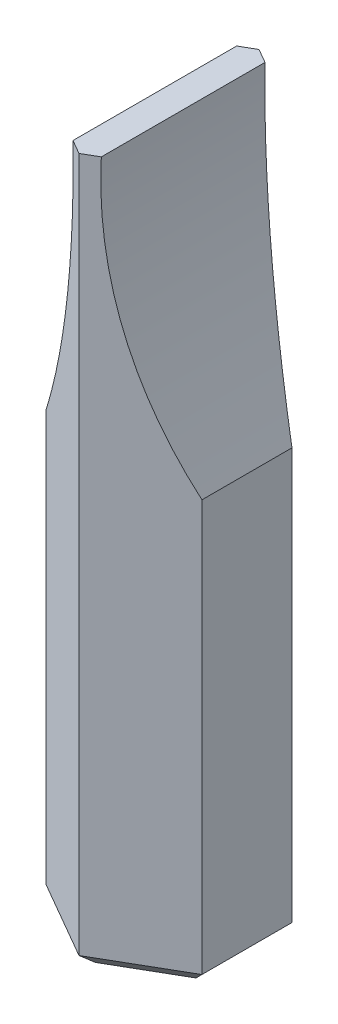
ISO-10303-21;
HEADER;
FILE_DESCRIPTION(('STEP AP214'),'2;1');
FILE_NAME('part.step','',(''),(''),'','','');
FILE_SCHEMA(('AUTOMOTIVE_DESIGN { 1 0 10303 214 1 1 1 1 }'));
ENDSEC;
DATA;
#1=APPLICATION_CONTEXT('core data for automotive mechanical design processes');
#2=APPLICATION_PROTOCOL_DEFINITION('international standard','automotive_design',2000,#1);
#3=PRODUCT_CONTEXT('',#1,'mechanical');
#4=PRODUCT('Part','Part','',(#3));
#5=PRODUCT_RELATED_PRODUCT_CATEGORY('part','',(#4));
#6=PRODUCT_DEFINITION_FORMATION('','',#4);
#7=PRODUCT_DEFINITION_CONTEXT('part definition',#1,'design');
#8=PRODUCT_DEFINITION('design','',#6,#7);
#9=PRODUCT_DEFINITION_SHAPE('','',#8);
#10=(LENGTH_UNIT() NAMED_UNIT(*) SI_UNIT(.MILLI.,.METRE.));
#11=(NAMED_UNIT(*) PLANE_ANGLE_UNIT() SI_UNIT($,.RADIAN.));
#12=(NAMED_UNIT(*) SI_UNIT($,.STERADIAN.) SOLID_ANGLE_UNIT());
#13=UNCERTAINTY_MEASURE_WITH_UNIT(LENGTH_MEASURE(1.E-05),#10,'distance_accuracy_value','');
#14=(GEOMETRIC_REPRESENTATION_CONTEXT(3) GLOBAL_UNCERTAINTY_ASSIGNED_CONTEXT((#13)) GLOBAL_UNIT_ASSIGNED_CONTEXT((#10,
#11,#12)) REPRESENTATION_CONTEXT('',''));
#15=CARTESIAN_POINT('',(0.,0.,0.));
#16=DIRECTION('',(0.,0.,1.));
#17=DIRECTION('',(1.,0.,0.));
#18=AXIS2_PLACEMENT_3D('',#15,#16,#17);
#19=CARTESIAN_POINT('',(2.74963065701557,25.,-1.58750000000003));
#20=DIRECTION('',(-0.499999999999995,0.,0.866025403784442));
#21=DIRECTION('',(0.866025403784442,0.,0.499999999999995));
#22=AXIS2_PLACEMENT_3D('',#19,#20,#21);
#23=PLANE('',#22);
#24=DIRECTION('',(0.,-1.,0.));
#25=VECTOR('',#24,1.);
#26=CARTESIAN_POINT('',(2.74963065701557,25.,-1.58750000000003));
#27=LINE('',#26,#25);
#28=CARTESIAN_POINT('',(2.74963065701561,15.,-1.58750000000003));
#29=VERTEX_POINT('',#28);
#30=CARTESIAN_POINT('',(2.74963065701557,0.5,-1.58750000000003));
#31=VERTEX_POINT('',#30);
#32=EDGE_CURVE('E128',#29,#31,#27,.T.);
#33=ORIENTED_EDGE('',*,*,#32,.T.);
#34=DIRECTION('',(-0.866025403784442,0.,-0.499999999999995));
#35=VECTOR('',#34,1.);
#36=CARTESIAN_POINT('',(2.74963065701557,0.5,-1.58750000000003));
#37=LINE('',#36,#35);
#38=CARTESIAN_POINT('',(0.,0.5,-3.175));
#39=VERTEX_POINT('',#38);
#40=EDGE_CURVE('E11',#31,#39,#37,.T.);
#41=ORIENTED_EDGE('',*,*,#40,.T.);
#42=DIRECTION('',(0.,-1.,0.));
#43=VECTOR('',#42,1.);
#44=CARTESIAN_POINT('',(0.,25.,-3.175));
#45=LINE('',#44,#43);
#46=CARTESIAN_POINT('',(0.,25.,-3.175));
#47=VERTEX_POINT('',#46);
#48=EDGE_CURVE('E152',#47,#39,#45,.T.);
#49=ORIENTED_EDGE('',*,*,#48,.F.);
#50=DIRECTION('',(-0.866025403784442,0.,-0.499999999999995));
#51=VECTOR('',#50,1.);
#52=CARTESIAN_POINT('',(2.74963065701557,25.,-1.58750000000003));
#53=LINE('',#52,#51);
#54=CARTESIAN_POINT('',(0.500000000000011,25.,-2.88632486540518));
#55=VERTEX_POINT('',#54);
#56=EDGE_CURVE('E131',#55,#47,#53,.T.);
#57=ORIENTED_EDGE('',*,*,#56,.F.);
#58=CARTESIAN_POINT('',(20.6488077793924,24.2796956636343,8.74659472987688));
#59=DIRECTION('',(-0.499999999999995,0.,0.866025403784442));
#60=DIRECTION('',(0.866025403784442,0.,0.499999999999995));
#61=AXIS2_PLACEMENT_3D('',#58,#59,#60);
#62=ELLIPSE('',#61,23.2807014003126,20.1616788305907);
#63=EDGE_CURVE('E121',#55,#29,#62,.T.);
#64=ORIENTED_EDGE('',*,*,#63,.T.);
#65=EDGE_LOOP('',(#33,#41,#49,#57,#64));
#66=FACE_BOUND('',#65,.T.);
#67=ADVANCED_FACE('F33',(#66),#23,.F.);
#68=CARTESIAN_POINT('',(0.,25.,-3.175));
#69=DIRECTION('',(0.500000000000001,0.,0.866025403784438));
#70=DIRECTION('',(0.866025403784438,0.,-0.500000000000001));
#71=AXIS2_PLACEMENT_3D('',#68,#69,#70);
#72=PLANE('',#71);
#73=ORIENTED_EDGE('',*,*,#48,.T.);
#74=DIRECTION('',(-0.866025403784438,0.,0.500000000000001));
#75=VECTOR('',#74,1.);
#76=CARTESIAN_POINT('',(0.,0.5,-3.175));
#77=LINE('',#76,#75);
#78=CARTESIAN_POINT('',(-2.7496306570156,0.5,-1.58749999999999));
#79=VERTEX_POINT('',#78);
#80=EDGE_CURVE('E159',#39,#79,#77,.T.);
#81=ORIENTED_EDGE('',*,*,#80,.T.);
#82=DIRECTION('',(0.,-1.,0.));
#83=VECTOR('',#82,1.);
#84=CARTESIAN_POINT('',(-2.7496306570156,25.,-1.58749999999999));
#85=LINE('',#84,#83);
#86=CARTESIAN_POINT('',(-2.74963065701558,15.,-1.58749999999999));
#87=VERTEX_POINT('',#86);
#88=EDGE_CURVE('E149',#87,#79,#85,.T.);
#89=ORIENTED_EDGE('',*,*,#88,.F.);
#90=CARTESIAN_POINT('',(-20.6488077793924,24.2796956636343,8.74659472987705));
#91=DIRECTION('',(0.500000000000001,0.,0.866025403784438));
#92=DIRECTION('',(-0.866025403784438,0.,0.500000000000001));
#93=AXIS2_PLACEMENT_3D('',#90,#91,#92);
#94=ELLIPSE('',#93,23.2807014003127,20.1616788305907);
#95=CARTESIAN_POINT('',(-0.499999999999978,25.,-2.8863248654052));
#96=VERTEX_POINT('',#95);
#97=EDGE_CURVE('E220',#87,#96,#94,.T.);
#98=ORIENTED_EDGE('',*,*,#97,.T.);
#99=DIRECTION('',(-0.866025403784438,0.,0.500000000000001));
#100=VECTOR('',#99,1.);
#101=CARTESIAN_POINT('',(0.,25.,-3.175));
#102=LINE('',#101,#100);
#103=EDGE_CURVE('E219',#47,#96,#102,.T.);
#104=ORIENTED_EDGE('',*,*,#103,.F.);
#105=EDGE_LOOP('',(#73,#81,#89,#98,#104));
#106=FACE_BOUND('',#105,.T.);
#107=ADVANCED_FACE('F215',(#106),#72,.F.);
#108=CARTESIAN_POINT('',(-2.7496306570156,25.,-1.58749999999999));
#109=DIRECTION('',(1.,0.,0.));
#110=DIRECTION('',(0.,0.,-1.));
#111=AXIS2_PLACEMENT_3D('',#108,#109,#110);
#112=PLANE('',#111);
#113=ORIENTED_EDGE('',*,*,#88,.T.);
#114=DIRECTION('',(0.,0.,1.));
#115=VECTOR('',#114,1.);
#116=CARTESIAN_POINT('',(-2.7496306570156,0.5,-1.58749999999999));
#117=LINE('',#116,#115);
#118=CARTESIAN_POINT('',(-2.74963065701558,0.5,1.58750000000001));
#119=VERTEX_POINT('',#118);
#120=EDGE_CURVE('E175',#79,#119,#117,.T.);
#121=ORIENTED_EDGE('',*,*,#120,.T.);
#122=DIRECTION('',(0.,-1.,0.));
#123=VECTOR('',#122,1.);
#124=CARTESIAN_POINT('',(-2.74963065701558,25.,1.58750000000001));
#125=LINE('',#124,#123);
#126=CARTESIAN_POINT('',(-2.74963065701558,15.,1.58750000000001));
#127=VERTEX_POINT('',#126);
#128=EDGE_CURVE('E146',#127,#119,#125,.T.);
#129=ORIENTED_EDGE('',*,*,#128,.F.);
#130=DIRECTION('',(0.,0.,1.));
#131=VECTOR('',#130,1.);
#132=CARTESIAN_POINT('',(-2.74963065701558,15.,-3.175));
#133=LINE('',#132,#131);
#134=EDGE_CURVE('E132',#87,#127,#133,.T.);
#135=ORIENTED_EDGE('',*,*,#134,.F.);
#136=EDGE_LOOP('',(#113,#121,#129,#135));
#137=FACE_BOUND('',#136,.T.);
#138=ADVANCED_FACE('F258',(#137),#112,.F.);
#139=CARTESIAN_POINT('',(-2.74963065701558,25.,1.58750000000001));
#140=DIRECTION('',(0.499999999999995,0.,-0.866025403784442));
#141=DIRECTION('',(-0.866025403784442,0.,-0.499999999999995));
#142=AXIS2_PLACEMENT_3D('',#139,#140,#141);
#143=PLANE('',#142);
#144=ORIENTED_EDGE('',*,*,#128,.T.);
#145=DIRECTION('',(0.866025403784442,0.,0.499999999999995));
#146=VECTOR('',#145,1.);
#147=CARTESIAN_POINT('',(-2.74963065701558,0.5,1.58750000000001));
#148=LINE('',#147,#146);
#149=CARTESIAN_POINT('',(0.,0.5,3.175));
#150=VERTEX_POINT('',#149);
#151=EDGE_CURVE('E177',#119,#150,#148,.T.);
#152=ORIENTED_EDGE('',*,*,#151,.T.);
#153=DIRECTION('',(0.,-1.,0.));
#154=VECTOR('',#153,1.);
#155=CARTESIAN_POINT('',(0.,25.,3.175));
#156=LINE('',#155,#154);
#157=CARTESIAN_POINT('',(0.,25.,3.175));
#158=VERTEX_POINT('',#157);
#159=EDGE_CURVE('E138',#158,#150,#156,.T.);
#160=ORIENTED_EDGE('',*,*,#159,.F.);
#161=DIRECTION('',(0.866025403784441,0.,0.499999999999995));
#162=VECTOR('',#161,1.);
#163=CARTESIAN_POINT('',(-2.74963065701558,25.,1.58750000000001));
#164=LINE('',#163,#162);
#165=CARTESIAN_POINT('',(-0.499999999999976,25.,2.88632486540519));
#166=VERTEX_POINT('',#165);
#167=EDGE_CURVE('E141',#166,#158,#164,.T.);
#168=ORIENTED_EDGE('',*,*,#167,.F.);
#169=CARTESIAN_POINT('',(-20.6488077793924,24.2796956636343,-8.74659472987687));
#170=DIRECTION('',(0.499999999999995,0.,-0.866025403784442));
#171=DIRECTION('',(0.866025403784442,0.,0.499999999999995));
#172=AXIS2_PLACEMENT_3D('',#169,#170,#171);
#173=ELLIPSE('',#172,23.2807014003126,20.1616788305907);
#174=EDGE_CURVE('E227',#166,#127,#173,.T.);
#175=ORIENTED_EDGE('',*,*,#174,.T.);
#176=EDGE_LOOP('',(#144,#152,#160,#168,#175));
#177=FACE_BOUND('',#176,.T.);
#178=ADVANCED_FACE('F237',(#177),#143,.F.);
#179=CARTESIAN_POINT('',(0.,25.,3.175));
#180=DIRECTION('',(-0.500000000000007,0.,-0.866025403784434));
#181=DIRECTION('',(-0.866025403784435,0.,0.500000000000007));
#182=AXIS2_PLACEMENT_3D('',#179,#180,#181);
#183=PLANE('',#182);
#184=ORIENTED_EDGE('',*,*,#159,.T.);
#185=DIRECTION('',(0.866025403784435,0.,-0.500000000000007));
#186=VECTOR('',#185,1.);
#187=CARTESIAN_POINT('',(0.,0.5,3.175));
#188=LINE('',#187,#186);
#189=CARTESIAN_POINT('',(2.74963065701561,0.5,1.58749999999997));
#190=VERTEX_POINT('',#189);
#191=EDGE_CURVE('E57',#150,#190,#188,.T.);
#192=ORIENTED_EDGE('',*,*,#191,.T.);
#193=DIRECTION('',(0.,-1.,0.));
#194=VECTOR('',#193,1.);
#195=CARTESIAN_POINT('',(2.74963065701561,25.,1.58749999999997));
#196=LINE('',#195,#194);
#197=CARTESIAN_POINT('',(2.74963065701561,15.,1.58749999999998));
#198=VERTEX_POINT('',#197);
#199=EDGE_CURVE('E135',#198,#190,#196,.T.);
#200=ORIENTED_EDGE('',*,*,#199,.F.);
#201=CARTESIAN_POINT('',(20.6488077793924,24.2796956636343,-8.74659472987725));
#202=DIRECTION('',(-0.500000000000007,0.,-0.866025403784434));
#203=DIRECTION('',(-0.866025403784435,0.,0.500000000000007));
#204=AXIS2_PLACEMENT_3D('',#201,#202,#203);
#205=ELLIPSE('',#204,23.2807014003128,20.1616788305907);
#206=CARTESIAN_POINT('',(0.500000000000022,25.,2.88632486540519));
#207=VERTEX_POINT('',#206);
#208=EDGE_CURVE('E124',#198,#207,#205,.T.);
#209=ORIENTED_EDGE('',*,*,#208,.T.);
#210=DIRECTION('',(0.866025403784434,0.,-0.500000000000007));
#211=VECTOR('',#210,1.);
#212=CARTESIAN_POINT('',(0.,25.,3.175));
#213=LINE('',#212,#211);
#214=EDGE_CURVE('E136',#158,#207,#213,.T.);
#215=ORIENTED_EDGE('',*,*,#214,.F.);
#216=EDGE_LOOP('',(#184,#192,#200,#209,#215));
#217=FACE_BOUND('',#216,.T.);
#218=ADVANCED_FACE('F232',(#217),#183,.F.);
#219=CARTESIAN_POINT('',(2.74963065701561,25.,1.58749999999997));
#220=DIRECTION('',(-1.,0.,0.));
#221=DIRECTION('',(0.,0.,1.));
#222=AXIS2_PLACEMENT_3D('',#219,#220,#221);
#223=PLANE('',#222);
#224=ORIENTED_EDGE('',*,*,#199,.T.);
#225=DIRECTION('',(0.,0.,-1.));
#226=VECTOR('',#225,1.);
#227=CARTESIAN_POINT('',(2.74963065701561,0.5,1.58749999999997));
#228=LINE('',#227,#226);
#229=EDGE_CURVE('E42',#190,#31,#228,.T.);
#230=ORIENTED_EDGE('',*,*,#229,.T.);
#231=ORIENTED_EDGE('',*,*,#32,.F.);
#232=DIRECTION('',(0.,0.,1.));
#233=VECTOR('',#232,1.);
#234=CARTESIAN_POINT('',(2.74963065701561,15.,-3.175));
#235=LINE('',#234,#233);
#236=EDGE_CURVE('E118',#29,#198,#235,.T.);
#237=ORIENTED_EDGE('',*,*,#236,.T.);
#238=EDGE_LOOP('',(#224,#230,#231,#237));
#239=FACE_BOUND('',#238,.T.);
#240=ADVANCED_FACE('F134',(#239),#223,.F.);
#241=CARTESIAN_POINT('',(0.,25.,0.));
#242=DIRECTION('',(0.,1.,0.));
#243=DIRECTION('',(0.,0.,1.));
#244=AXIS2_PLACEMENT_3D('',#241,#242,#243);
#245=PLANE('',#244);
#246=DIRECTION('',(0.,0.,1.));
#247=VECTOR('',#246,1.);
#248=CARTESIAN_POINT('',(0.500000000000011,25.,-3.175));
#249=LINE('',#248,#247);
#250=EDGE_CURVE('E157',#55,#207,#249,.T.);
#251=ORIENTED_EDGE('',*,*,#250,.F.);
#252=ORIENTED_EDGE('',*,*,#56,.T.);
#253=ORIENTED_EDGE('',*,*,#103,.T.);
#254=DIRECTION('',(0.,0.,1.));
#255=VECTOR('',#254,1.);
#256=CARTESIAN_POINT('',(-0.499999999999976,25.,-3.175));
#257=LINE('',#256,#255);
#258=EDGE_CURVE('E155',#166,#96,#257,.F.);
#259=ORIENTED_EDGE('',*,*,#258,.F.);
#260=ORIENTED_EDGE('',*,*,#167,.T.);
#261=ORIENTED_EDGE('',*,*,#214,.T.);
#262=EDGE_LOOP('',(#251,#252,#253,#259,#260,#261));
#263=FACE_BOUND('',#262,.T.);
#264=ADVANCED_FACE('F233',(#263),#245,.T.);
#265=CARTESIAN_POINT('',(0.,0.,0.));
#266=DIRECTION('',(0.,1.,0.));
#267=DIRECTION('',(0.,0.,1.));
#268=AXIS2_PLACEMENT_3D('',#265,#266,#267);
#269=PLANE('',#268);
#270=DIRECTION('',(0.,0.,-1.));
#271=VECTOR('',#270,1.);
#272=CARTESIAN_POINT('',(-2.24963065701559,0.,0.));
#273=LINE('',#272,#271);
#274=CARTESIAN_POINT('',(-2.24963065701558,0.,1.2988248654052));
#275=VERTEX_POINT('',#274);
#276=CARTESIAN_POINT('',(-2.24963065701559,0.,-1.29882486540518));
#277=VERTEX_POINT('',#276);
#278=EDGE_CURVE('E170',#275,#277,#273,.T.);
#279=ORIENTED_EDGE('',*,*,#278,.T.);
#280=DIRECTION('',(0.866025403784438,0.,-0.500000000000001));
#281=VECTOR('',#280,1.);
#282=CARTESIAN_POINT('',(-1.1248153285078,0.,-1.94823729810778));
#283=LINE('',#282,#281);
#284=CARTESIAN_POINT('',(0.,0.,-2.59764973081037));
#285=VERTEX_POINT('',#284);
#286=EDGE_CURVE('E172',#277,#285,#283,.T.);
#287=ORIENTED_EDGE('',*,*,#286,.T.);
#288=DIRECTION('',(0.866025403784442,0.,0.499999999999995));
#289=VECTOR('',#288,1.);
#290=CARTESIAN_POINT('',(1.12481532850779,0.,-1.94823729810779));
#291=LINE('',#290,#289);
#292=CARTESIAN_POINT('',(2.24963065701558,0.,-1.29882486540521));
#293=VERTEX_POINT('',#292);
#294=EDGE_CURVE('E162',#285,#293,#291,.T.);
#295=ORIENTED_EDGE('',*,*,#294,.T.);
#296=DIRECTION('',(0.,0.,1.));
#297=VECTOR('',#296,1.);
#298=CARTESIAN_POINT('',(2.24963065701559,0.,0.));
#299=LINE('',#298,#297);
#300=CARTESIAN_POINT('',(2.2496306570156,0.,1.29882486540517));
#301=VERTEX_POINT('',#300);
#302=EDGE_CURVE('E164',#293,#301,#299,.T.);
#303=ORIENTED_EDGE('',*,*,#302,.T.);
#304=DIRECTION('',(-0.866025403784435,0.,0.500000000000007));
#305=VECTOR('',#304,1.);
#306=CARTESIAN_POINT('',(1.12481532850781,0.,1.94823729810777));
#307=LINE('',#306,#305);
#308=CARTESIAN_POINT('',(0.,0.,2.59764973081037));
#309=VERTEX_POINT('',#308);
#310=EDGE_CURVE('E166',#301,#309,#307,.T.);
#311=ORIENTED_EDGE('',*,*,#310,.T.);
#312=DIRECTION('',(-0.866025403784442,0.,-0.499999999999995));
#313=VECTOR('',#312,1.);
#314=CARTESIAN_POINT('',(-1.12481532850778,0.,1.94823729810778));
#315=LINE('',#314,#313);
#316=EDGE_CURVE('E168',#309,#275,#315,.T.);
#317=ORIENTED_EDGE('',*,*,#316,.T.);
#318=EDGE_LOOP('',(#279,#287,#295,#303,#311,#317));
#319=FACE_BOUND('',#318,.T.);
#320=ADVANCED_FACE('F204',(#319),#269,.F.);
#321=CARTESIAN_POINT('',(-20.6488077793924,24.2796956636343,-3.175));
#322=DIRECTION('',(0.,0.,1.));
#323=DIRECTION('',(1.,0.,0.));
#324=AXIS2_PLACEMENT_3D('',#321,#322,#323);
#325=CYLINDRICAL_SURFACE('',#324,20.1616788305907);
#326=ORIENTED_EDGE('',*,*,#134,.T.);
#327=ORIENTED_EDGE('',*,*,#174,.F.);
#328=ORIENTED_EDGE('',*,*,#258,.T.);
#329=ORIENTED_EDGE('',*,*,#97,.F.);
#330=EDGE_LOOP('',(#326,#327,#328,#329));
#331=FACE_BOUND('',#330,.T.);
#332=ADVANCED_FACE('F272',(#331),#325,.F.);
#333=CARTESIAN_POINT('',(20.6488077793924,24.2796956636343,-3.175));
#334=DIRECTION('',(0.,0.,1.));
#335=DIRECTION('',(1.,0.,0.));
#336=AXIS2_PLACEMENT_3D('',#333,#334,#335);
#337=CYLINDRICAL_SURFACE('',#336,20.1616788305907);
#338=ORIENTED_EDGE('',*,*,#250,.T.);
#339=ORIENTED_EDGE('',*,*,#208,.F.);
#340=ORIENTED_EDGE('',*,*,#236,.F.);
#341=ORIENTED_EDGE('',*,*,#63,.F.);
#342=EDGE_LOOP('',(#338,#339,#340,#341));
#343=FACE_BOUND('',#342,.T.);
#344=ADVANCED_FACE('F120',(#343),#337,.F.);
#345=CARTESIAN_POINT('',(0.,0.5,3.175));
#346=DIRECTION('',(-0.353553390593279,0.707106781186548,-0.612372435695791));
#347=DIRECTION('',(0.866025403784435,0.,-0.500000000000007));
#348=AXIS2_PLACEMENT_3D('',#345,#346,#347);
#349=PLANE('',#348);
#350=DIRECTION('',(0.,-0.654653670707976,-0.755928946018455));
#351=VECTOR('',#350,1.);
#352=CARTESIAN_POINT('',(0.,0.500000000000001,3.175));
#353=LINE('',#352,#351);
#354=EDGE_CURVE('E190',#309,#150,#353,.F.);
#355=ORIENTED_EDGE('',*,*,#354,.F.);
#356=ORIENTED_EDGE('',*,*,#310,.F.);
#357=DIRECTION('',(-0.654653670707981,-0.654653670707976,-0.377964473009221));
#358=VECTOR('',#357,1.);
#359=CARTESIAN_POINT('',(2.74963065701561,0.500000000000001,1.58749999999997));
#360=LINE('',#359,#358);
#361=EDGE_CURVE('E37',#190,#301,#360,.T.);
#362=ORIENTED_EDGE('',*,*,#361,.F.);
#363=ORIENTED_EDGE('',*,*,#191,.F.);
#364=EDGE_LOOP('',(#355,#356,#362,#363));
#365=FACE_BOUND('',#364,.T.);
#366=ADVANCED_FACE('F35',(#365),#349,.F.);
#367=CARTESIAN_POINT('',(2.74963065701561,0.5,1.58749999999997));
#368=DIRECTION('',(-0.707106781186547,0.707106781186548,0.));
#369=DIRECTION('',(0.,0.,-1.));
#370=AXIS2_PLACEMENT_3D('',#367,#368,#369);
#371=PLANE('',#370);
#372=ORIENTED_EDGE('',*,*,#361,.T.);
#373=ORIENTED_EDGE('',*,*,#302,.F.);
#374=DIRECTION('',(-0.654653670707974,-0.654653670707977,0.377964473009233));
#375=VECTOR('',#374,1.);
#376=CARTESIAN_POINT('',(2.74963065701557,0.5,-1.58750000000003));
#377=LINE('',#376,#375);
#378=EDGE_CURVE('E188',#31,#293,#377,.T.);
#379=ORIENTED_EDGE('',*,*,#378,.F.);
#380=ORIENTED_EDGE('',*,*,#229,.F.);
#381=EDGE_LOOP('',(#372,#373,#379,#380));
#382=FACE_BOUND('',#381,.T.);
#383=ADVANCED_FACE('F200',(#382),#371,.F.);
#384=CARTESIAN_POINT('',(-2.74963065701558,0.5,1.58750000000001));
#385=DIRECTION('',(0.35355339059327,0.707106781186548,-0.612372435695796));
#386=DIRECTION('',(0.866025403784442,0.,0.499999999999995));
#387=AXIS2_PLACEMENT_3D('',#384,#385,#386);
#388=PLANE('',#387);
#389=ORIENTED_EDGE('',*,*,#354,.T.);
#390=ORIENTED_EDGE('',*,*,#151,.F.);
#391=DIRECTION('',(0.654653670707976,-0.654653670707977,-0.37796447300923));
#392=VECTOR('',#391,1.);
#393=CARTESIAN_POINT('',(-2.74963065701558,0.5,1.58750000000001));
#394=LINE('',#393,#392);
#395=EDGE_CURVE('E185',#275,#119,#394,.F.);
#396=ORIENTED_EDGE('',*,*,#395,.F.);
#397=ORIENTED_EDGE('',*,*,#316,.F.);
#398=EDGE_LOOP('',(#389,#390,#396,#397));
#399=FACE_BOUND('',#398,.T.);
#400=ADVANCED_FACE('F239',(#399),#388,.F.);
#401=CARTESIAN_POINT('',(2.74963065701557,0.5,-1.58750000000003));
#402=DIRECTION('',(-0.35355339059327,0.707106781186548,0.612372435695796));
#403=DIRECTION('',(-0.866025403784442,0.,-0.499999999999995));
#404=AXIS2_PLACEMENT_3D('',#401,#402,#403);
#405=PLANE('',#404);
#406=ORIENTED_EDGE('',*,*,#378,.T.);
#407=ORIENTED_EDGE('',*,*,#294,.F.);
#408=DIRECTION('',(0.,0.654653670707977,-0.755928946018454));
#409=VECTOR('',#408,1.);
#410=CARTESIAN_POINT('',(0.,-0.2856087591473,-2.26785714285716));
#411=LINE('',#410,#409);
#412=EDGE_CURVE('E183',#39,#285,#411,.F.);
#413=ORIENTED_EDGE('',*,*,#412,.F.);
#414=ORIENTED_EDGE('',*,*,#40,.F.);
#415=EDGE_LOOP('',(#406,#407,#413,#414));
#416=FACE_BOUND('',#415,.T.);
#417=ADVANCED_FACE('F210',(#416),#405,.F.);
#418=CARTESIAN_POINT('',(-2.7496306570156,0.5,-1.58749999999999));
#419=DIRECTION('',(0.707106781186547,0.707106781186548,0.));
#420=DIRECTION('',(0.,0.,1.));
#421=AXIS2_PLACEMENT_3D('',#418,#419,#420);
#422=PLANE('',#421);
#423=ORIENTED_EDGE('',*,*,#395,.T.);
#424=ORIENTED_EDGE('',*,*,#120,.F.);
#425=DIRECTION('',(0.654653670707978,-0.654653670707977,0.377964473009226));
#426=VECTOR('',#425,1.);
#427=CARTESIAN_POINT('',(-2.7496306570156,0.5,-1.58749999999999));
#428=LINE('',#427,#426);
#429=EDGE_CURVE('E181',#277,#79,#428,.F.);
#430=ORIENTED_EDGE('',*,*,#429,.F.);
#431=ORIENTED_EDGE('',*,*,#278,.F.);
#432=EDGE_LOOP('',(#423,#424,#430,#431));
#433=FACE_BOUND('',#432,.T.);
#434=ADVANCED_FACE('F243',(#433),#422,.F.);
#435=CARTESIAN_POINT('',(0.,0.5,-3.175));
#436=DIRECTION('',(0.353553390593274,0.707106781186548,0.612372435695794));
#437=DIRECTION('',(-0.866025403784438,0.,0.500000000000001));
#438=AXIS2_PLACEMENT_3D('',#435,#436,#437);
#439=PLANE('',#438);
#440=ORIENTED_EDGE('',*,*,#412,.T.);
#441=ORIENTED_EDGE('',*,*,#286,.F.);
#442=ORIENTED_EDGE('',*,*,#429,.T.);
#443=ORIENTED_EDGE('',*,*,#80,.F.);
#444=EDGE_LOOP('',(#440,#441,#442,#443));
#445=FACE_BOUND('',#444,.T.);
#446=ADVANCED_FACE('F246',(#445),#439,.F.);
#447=CLOSED_SHELL('',(#67,#107,#138,#178,#218,#240,#264,#320,#332,#344,#366,#383,#400,#417,#434,#446));
#448=MANIFOLD_SOLID_BREP('B2',#447);
#449=ADVANCED_BREP_SHAPE_REPRESENTATION('',(#18,#448),#14);
#450=SHAPE_DEFINITION_REPRESENTATION(#9,#449);
ENDSEC;
END-ISO-10303-21;
